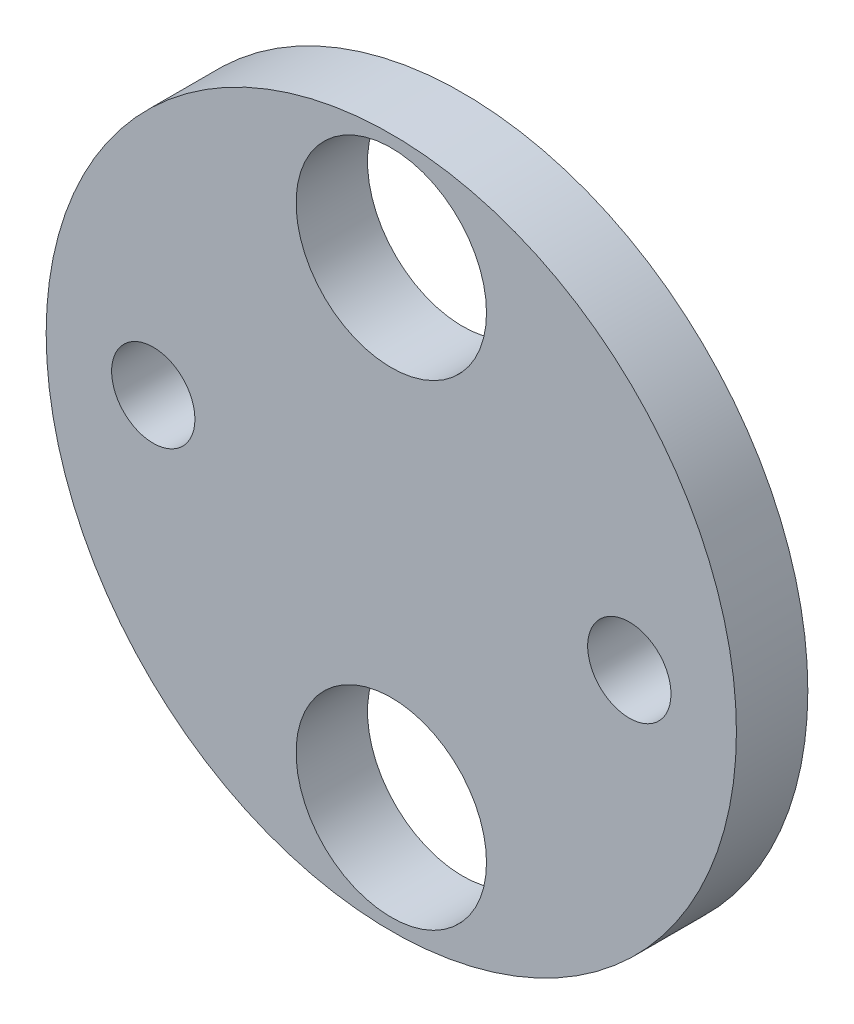
ISO-10303-21;
HEADER;
FILE_DESCRIPTION(('STEP AP214'),'2;1');
FILE_NAME('part.step','',(''),(''),'','','');
FILE_SCHEMA(('AUTOMOTIVE_DESIGN { 1 0 10303 214 1 1 1 1 }'));
ENDSEC;
DATA;
#1=APPLICATION_CONTEXT('core data for automotive mechanical design processes');
#2=APPLICATION_PROTOCOL_DEFINITION('international standard','automotive_design',2000,#1);
#3=PRODUCT_CONTEXT('',#1,'mechanical');
#4=PRODUCT('Part','Part','',(#3));
#5=PRODUCT_RELATED_PRODUCT_CATEGORY('part','',(#4));
#6=PRODUCT_DEFINITION_FORMATION('','',#4);
#7=PRODUCT_DEFINITION_CONTEXT('part definition',#1,'design');
#8=PRODUCT_DEFINITION('design','',#6,#7);
#9=PRODUCT_DEFINITION_SHAPE('','',#8);
#10=(LENGTH_UNIT() NAMED_UNIT(*) SI_UNIT(.MILLI.,.METRE.));
#11=(NAMED_UNIT(*) PLANE_ANGLE_UNIT() SI_UNIT($,.RADIAN.));
#12=(NAMED_UNIT(*) SI_UNIT($,.STERADIAN.) SOLID_ANGLE_UNIT());
#13=UNCERTAINTY_MEASURE_WITH_UNIT(LENGTH_MEASURE(1.E-05),#10,'distance_accuracy_value','');
#14=(GEOMETRIC_REPRESENTATION_CONTEXT(3) GLOBAL_UNCERTAINTY_ASSIGNED_CONTEXT((#13)) GLOBAL_UNIT_ASSIGNED_CONTEXT((#10,
#11,#12)) REPRESENTATION_CONTEXT('',''));
#15=CARTESIAN_POINT('',(0.,0.,0.));
#16=DIRECTION('',(0.,0.,1.));
#17=DIRECTION('',(1.,0.,0.));
#18=AXIS2_PLACEMENT_3D('',#15,#16,#17);
#19=CARTESIAN_POINT('',(0.,0.,3.));
#20=DIRECTION('',(0.,0.,1.));
#21=DIRECTION('',(1.,0.,0.));
#22=AXIS2_PLACEMENT_3D('',#19,#20,#21);
#23=PLANE('',#22);
#24=CARTESIAN_POINT('',(0.,-10.,3.));
#25=DIRECTION('',(0.,0.,1.));
#26=DIRECTION('',(1.,0.,0.));
#27=AXIS2_PLACEMENT_3D('',#24,#25,#26);
#28=CIRCLE('',#27,4.);
#29=CARTESIAN_POINT('',(4.,-10.,3.));
#30=VERTEX_POINT('',#29);
#31=EDGE_CURVE('E57',#30,#30,#28,.T.);
#32=ORIENTED_EDGE('',*,*,#31,.F.);
#33=EDGE_LOOP('',(#32));
#34=FACE_BOUND('',#33,.T.);
#35=CARTESIAN_POINT('',(-10.,0.,3.));
#36=DIRECTION('',(0.,0.,1.));
#37=DIRECTION('',(1.,0.,0.));
#38=AXIS2_PLACEMENT_3D('',#35,#36,#37);
#39=CIRCLE('',#38,1.75);
#40=CARTESIAN_POINT('',(-8.25,0.,3.));
#41=VERTEX_POINT('',#40);
#42=EDGE_CURVE('E46',#41,#41,#39,.T.);
#43=ORIENTED_EDGE('',*,*,#42,.F.);
#44=EDGE_LOOP('',(#43));
#45=FACE_BOUND('',#44,.T.);
#46=CARTESIAN_POINT('',(0.,0.,3.));
#47=DIRECTION('',(0.,0.,1.));
#48=DIRECTION('',(1.,0.,0.));
#49=AXIS2_PLACEMENT_3D('',#46,#47,#48);
#50=CIRCLE('',#49,14.5);
#51=CARTESIAN_POINT('',(14.5,0.,3.));
#52=VERTEX_POINT('',#51);
#53=EDGE_CURVE('E10',#52,#52,#50,.T.);
#54=ORIENTED_EDGE('',*,*,#53,.T.);
#55=EDGE_LOOP('',(#54));
#56=FACE_BOUND('',#55,.T.);
#57=CARTESIAN_POINT('',(10.,0.,3.));
#58=DIRECTION('',(0.,0.,1.));
#59=DIRECTION('',(1.,0.,0.));
#60=AXIS2_PLACEMENT_3D('',#57,#58,#59);
#61=CIRCLE('',#60,1.75);
#62=CARTESIAN_POINT('',(11.75,0.,3.));
#63=VERTEX_POINT('',#62);
#64=EDGE_CURVE('E51',#63,#63,#61,.T.);
#65=ORIENTED_EDGE('',*,*,#64,.F.);
#66=EDGE_LOOP('',(#65));
#67=FACE_BOUND('',#66,.T.);
#68=CARTESIAN_POINT('',(0.,10.,3.));
#69=DIRECTION('',(0.,0.,1.));
#70=DIRECTION('',(1.,0.,0.));
#71=AXIS2_PLACEMENT_3D('',#68,#69,#70);
#72=CIRCLE('',#71,4.);
#73=CARTESIAN_POINT('',(4.,10.,3.));
#74=VERTEX_POINT('',#73);
#75=EDGE_CURVE('E63',#74,#74,#72,.T.);
#76=ORIENTED_EDGE('',*,*,#75,.F.);
#77=EDGE_LOOP('',(#76));
#78=FACE_BOUND('',#77,.T.);
#79=ADVANCED_FACE('F35',(#34,#45,#56,#67,#78),#23,.T.);
#80=CARTESIAN_POINT('',(0.,0.,0.));
#81=DIRECTION('',(0.,0.,1.));
#82=DIRECTION('',(1.,0.,0.));
#83=AXIS2_PLACEMENT_3D('',#80,#81,#82);
#84=PLANE('',#83);
#85=CARTESIAN_POINT('',(0.,0.,0.));
#86=DIRECTION('',(0.,0.,1.));
#87=DIRECTION('',(1.,0.,0.));
#88=AXIS2_PLACEMENT_3D('',#85,#86,#87);
#89=CIRCLE('',#88,14.5);
#90=CARTESIAN_POINT('',(14.5,0.,0.));
#91=VERTEX_POINT('',#90);
#92=EDGE_CURVE('E39',#91,#91,#89,.T.);
#93=ORIENTED_EDGE('',*,*,#92,.F.);
#94=EDGE_LOOP('',(#93));
#95=FACE_BOUND('',#94,.T.);
#96=CARTESIAN_POINT('',(-10.,0.,0.));
#97=DIRECTION('',(0.,0.,1.));
#98=DIRECTION('',(1.,0.,0.));
#99=AXIS2_PLACEMENT_3D('',#96,#97,#98);
#100=CIRCLE('',#99,1.75);
#101=CARTESIAN_POINT('',(-8.25,0.,0.));
#102=VERTEX_POINT('',#101);
#103=EDGE_CURVE('E48',#102,#102,#100,.T.);
#104=ORIENTED_EDGE('',*,*,#103,.T.);
#105=EDGE_LOOP('',(#104));
#106=FACE_BOUND('',#105,.T.);
#107=CARTESIAN_POINT('',(10.,0.,0.));
#108=DIRECTION('',(0.,0.,1.));
#109=DIRECTION('',(1.,0.,0.));
#110=AXIS2_PLACEMENT_3D('',#107,#108,#109);
#111=CIRCLE('',#110,1.75);
#112=CARTESIAN_POINT('',(11.75,0.,0.));
#113=VERTEX_POINT('',#112);
#114=EDGE_CURVE('E54',#113,#113,#111,.T.);
#115=ORIENTED_EDGE('',*,*,#114,.T.);
#116=EDGE_LOOP('',(#115));
#117=FACE_BOUND('',#116,.T.);
#118=CARTESIAN_POINT('',(0.,-10.,0.));
#119=DIRECTION('',(0.,0.,1.));
#120=DIRECTION('',(1.,0.,0.));
#121=AXIS2_PLACEMENT_3D('',#118,#119,#120);
#122=CIRCLE('',#121,4.);
#123=CARTESIAN_POINT('',(4.,-10.,0.));
#124=VERTEX_POINT('',#123);
#125=EDGE_CURVE('E60',#124,#124,#122,.T.);
#126=ORIENTED_EDGE('',*,*,#125,.T.);
#127=EDGE_LOOP('',(#126));
#128=FACE_BOUND('',#127,.T.);
#129=CARTESIAN_POINT('',(0.,10.,0.));
#130=DIRECTION('',(0.,0.,1.));
#131=DIRECTION('',(1.,0.,0.));
#132=AXIS2_PLACEMENT_3D('',#129,#130,#131);
#133=CIRCLE('',#132,4.);
#134=CARTESIAN_POINT('',(4.,10.,0.));
#135=VERTEX_POINT('',#134);
#136=EDGE_CURVE('E66',#135,#135,#133,.T.);
#137=ORIENTED_EDGE('',*,*,#136,.T.);
#138=EDGE_LOOP('',(#137));
#139=FACE_BOUND('',#138,.T.);
#140=ADVANCED_FACE('F76',(#95,#106,#117,#128,#139),#84,.F.);
#141=CARTESIAN_POINT('',(0.,0.,3.));
#142=DIRECTION('',(0.,0.,-1.));
#143=DIRECTION('',(-1.,0.,0.));
#144=AXIS2_PLACEMENT_3D('',#141,#142,#143);
#145=CYLINDRICAL_SURFACE('',#144,14.5);
#146=ORIENTED_EDGE('',*,*,#53,.F.);
#147=EDGE_LOOP('',(#146));
#148=FACE_BOUND('',#147,.T.);
#149=ORIENTED_EDGE('',*,*,#92,.T.);
#150=EDGE_LOOP('',(#149));
#151=FACE_BOUND('',#150,.T.);
#152=ADVANCED_FACE('F37',(#148,#151),#145,.T.);
#153=CARTESIAN_POINT('',(-10.,0.,3.));
#154=DIRECTION('',(0.,0.,-1.));
#155=DIRECTION('',(-1.,0.,0.));
#156=AXIS2_PLACEMENT_3D('',#153,#154,#155);
#157=CYLINDRICAL_SURFACE('',#156,1.75);
#158=ORIENTED_EDGE('',*,*,#42,.T.);
#159=EDGE_LOOP('',(#158));
#160=FACE_BOUND('',#159,.T.);
#161=ORIENTED_EDGE('',*,*,#103,.F.);
#162=EDGE_LOOP('',(#161));
#163=FACE_BOUND('',#162,.T.);
#164=ADVANCED_FACE('F86',(#160,#163),#157,.F.);
#165=CARTESIAN_POINT('',(10.,0.,3.));
#166=DIRECTION('',(0.,0.,-1.));
#167=DIRECTION('',(-1.,0.,0.));
#168=AXIS2_PLACEMENT_3D('',#165,#166,#167);
#169=CYLINDRICAL_SURFACE('',#168,1.75);
#170=ORIENTED_EDGE('',*,*,#64,.T.);
#171=EDGE_LOOP('',(#170));
#172=FACE_BOUND('',#171,.T.);
#173=ORIENTED_EDGE('',*,*,#114,.F.);
#174=EDGE_LOOP('',(#173));
#175=FACE_BOUND('',#174,.T.);
#176=ADVANCED_FACE('F89',(#172,#175),#169,.F.);
#177=CARTESIAN_POINT('',(0.,-10.,3.));
#178=DIRECTION('',(0.,0.,-1.));
#179=DIRECTION('',(-1.,0.,0.));
#180=AXIS2_PLACEMENT_3D('',#177,#178,#179);
#181=CYLINDRICAL_SURFACE('',#180,4.);
#182=ORIENTED_EDGE('',*,*,#31,.T.);
#183=EDGE_LOOP('',(#182));
#184=FACE_BOUND('',#183,.T.);
#185=ORIENTED_EDGE('',*,*,#125,.F.);
#186=EDGE_LOOP('',(#185));
#187=FACE_BOUND('',#186,.T.);
#188=ADVANCED_FACE('F93',(#184,#187),#181,.F.);
#189=CARTESIAN_POINT('',(0.,10.,3.));
#190=DIRECTION('',(0.,0.,-1.));
#191=DIRECTION('',(-1.,0.,0.));
#192=AXIS2_PLACEMENT_3D('',#189,#190,#191);
#193=CYLINDRICAL_SURFACE('',#192,4.);
#194=ORIENTED_EDGE('',*,*,#75,.T.);
#195=EDGE_LOOP('',(#194));
#196=FACE_BOUND('',#195,.T.);
#197=ORIENTED_EDGE('',*,*,#136,.F.);
#198=EDGE_LOOP('',(#197));
#199=FACE_BOUND('',#198,.T.);
#200=ADVANCED_FACE('F72',(#196,#199),#193,.F.);
#201=CLOSED_SHELL('',(#79,#140,#152,#164,#176,#188,#200));
#202=MANIFOLD_SOLID_BREP('B2',#201);
#203=ADVANCED_BREP_SHAPE_REPRESENTATION('',(#18,#202),#14);
#204=SHAPE_DEFINITION_REPRESENTATION(#9,#203);
ENDSEC;
END-ISO-10303-21;
